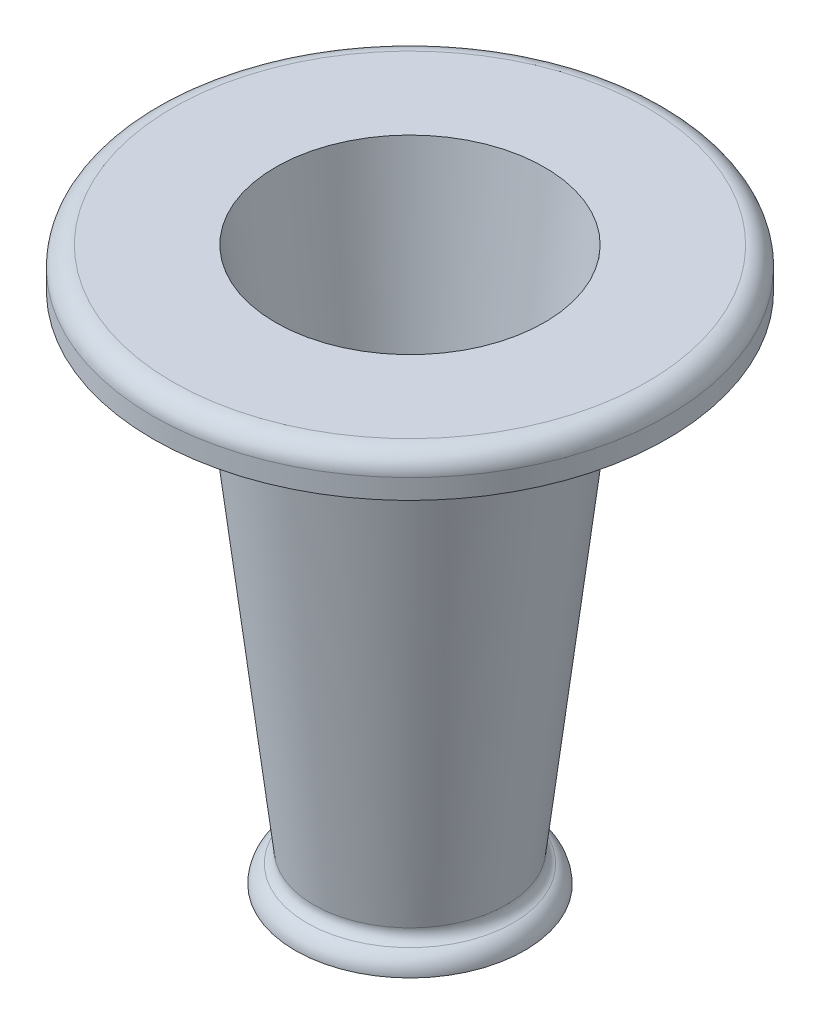
ISO-10303-21;
HEADER;
FILE_DESCRIPTION(('STEP AP214'),'2;1');
FILE_NAME('part.step','',(''),(''),'','','');
FILE_SCHEMA(('AUTOMOTIVE_DESIGN { 1 0 10303 214 1 1 1 1 }'));
ENDSEC;
DATA;
#1=APPLICATION_CONTEXT('core data for automotive mechanical design processes');
#2=APPLICATION_PROTOCOL_DEFINITION('international standard','automotive_design',2000,#1);
#3=PRODUCT_CONTEXT('',#1,'mechanical');
#4=PRODUCT('Part','Part','',(#3));
#5=PRODUCT_RELATED_PRODUCT_CATEGORY('part','',(#4));
#6=PRODUCT_DEFINITION_FORMATION('','',#4);
#7=PRODUCT_DEFINITION_CONTEXT('part definition',#1,'design');
#8=PRODUCT_DEFINITION('design','',#6,#7);
#9=PRODUCT_DEFINITION_SHAPE('','',#8);
#10=(LENGTH_UNIT() NAMED_UNIT(*) SI_UNIT(.MILLI.,.METRE.));
#11=(NAMED_UNIT(*) PLANE_ANGLE_UNIT() SI_UNIT($,.RADIAN.));
#12=(NAMED_UNIT(*) SI_UNIT($,.STERADIAN.) SOLID_ANGLE_UNIT());
#13=UNCERTAINTY_MEASURE_WITH_UNIT(LENGTH_MEASURE(1.E-05),#10,'distance_accuracy_value','');
#14=(GEOMETRIC_REPRESENTATION_CONTEXT(3) GLOBAL_UNCERTAINTY_ASSIGNED_CONTEXT((#13)) GLOBAL_UNIT_ASSIGNED_CONTEXT((#10,
#11,#12)) REPRESENTATION_CONTEXT('',''));
#15=CARTESIAN_POINT('',(0.,0.,0.));
#16=DIRECTION('',(0.,0.,1.));
#17=DIRECTION('',(1.,0.,0.));
#18=AXIS2_PLACEMENT_3D('',#15,#16,#17);
#19=CARTESIAN_POINT('',(0.,135.,0.));
#20=DIRECTION('',(0.,1.,0.));
#21=DIRECTION('',(0.,0.,1.));
#22=AXIS2_PLACEMENT_3D('',#19,#20,#21);
#23=PLANE('',#22);
#24=CARTESIAN_POINT('',(0.,135.,0.));
#25=DIRECTION('',(0.,1.,0.));
#26=DIRECTION('',(0.,0.,1.));
#27=AXIS2_PLACEMENT_3D('',#24,#25,#26);
#28=CIRCLE('',#27,57.5);
#29=CARTESIAN_POINT('',(0.,135.,57.5));
#30=VERTEX_POINT('',#29);
#31=EDGE_CURVE('E62',#30,#30,#28,.F.);
#32=ORIENTED_EDGE('',*,*,#31,.T.);
#33=EDGE_LOOP('',(#32));
#34=FACE_BOUND('',#33,.T.);
#35=CARTESIAN_POINT('',(0.,135.,0.));
#36=DIRECTION('',(0.,1.,0.));
#37=DIRECTION('',(0.,0.,1.));
#38=AXIS2_PLACEMENT_3D('',#35,#36,#37);
#39=CIRCLE('',#38,39.);
#40=CARTESIAN_POINT('',(0.,135.,39.));
#41=VERTEX_POINT('',#40);
#42=EDGE_CURVE('E68',#41,#41,#39,.T.);
#43=ORIENTED_EDGE('',*,*,#42,.T.);
#44=EDGE_LOOP('',(#43));
#45=FACE_BOUND('',#44,.T.);
#46=ADVANCED_FACE('F37',(#34,#45),#23,.F.);
#47=CARTESIAN_POINT('',(0.,0.,0.));
#48=DIRECTION('',(0.,1.,0.));
#49=DIRECTION('',(0.,0.,1.));
#50=AXIS2_PLACEMENT_3D('',#47,#48,#49);
#51=PLANE('',#50);
#52=CARTESIAN_POINT('',(0.,0.,0.));
#53=DIRECTION('',(0.,-1.,0.));
#54=DIRECTION('',(0.,0.,-1.));
#55=AXIS2_PLACEMENT_3D('',#52,#53,#54);
#56=CIRCLE('',#55,23.);
#57=CARTESIAN_POINT('',(0.,0.,-23.));
#58=VERTEX_POINT('',#57);
#59=EDGE_CURVE('E57',#58,#58,#56,.T.);
#60=ORIENTED_EDGE('',*,*,#59,.F.);
#61=EDGE_LOOP('',(#60));
#62=FACE_BOUND('',#61,.T.);
#63=CARTESIAN_POINT('',(0.,0.,0.));
#64=DIRECTION('',(0.,1.,0.));
#65=DIRECTION('',(0.,0.,1.));
#66=AXIS2_PLACEMENT_3D('',#63,#64,#65);
#67=CIRCLE('',#66,29.);
#68=CARTESIAN_POINT('',(0.,0.,29.));
#69=VERTEX_POINT('',#68);
#70=EDGE_CURVE('E65',#69,#69,#67,.T.);
#71=ORIENTED_EDGE('',*,*,#70,.F.);
#72=EDGE_LOOP('',(#71));
#73=FACE_BOUND('',#72,.T.);
#74=ADVANCED_FACE('F109',(#62,#73),#51,.F.);
#75=CARTESIAN_POINT('',(0.,5.,0.));
#76=DIRECTION('',(0.,1.,0.));
#77=DIRECTION('',(0.,0.,1.));
#78=AXIS2_PLACEMENT_3D('',#75,#76,#77);
#79=CONICAL_SURFACE('',#78,24.,0.114876605416899);
#80=CARTESIAN_POINT('',(0.,7.6384580295691,0.));
#81=DIRECTION('',(0.,1.,0.));
#82=DIRECTION('',(0.,0.,1.));
#83=AXIS2_PLACEMENT_3D('',#80,#81,#82);
#84=CIRCLE('',#83,24.3044374649503);
#85=CARTESIAN_POINT('',(0.,7.6384580295691,24.3044374649503));
#86=VERTEX_POINT('',#85);
#87=EDGE_CURVE('E44',#86,#86,#84,.T.);
#88=ORIENTED_EDGE('',*,*,#87,.T.);
#89=EDGE_LOOP('',(#88));
#90=FACE_BOUND('',#89,.T.);
#91=ORIENTED_EDGE('',*,*,#42,.F.);
#92=EDGE_LOOP('',(#91));
#93=FACE_BOUND('',#92,.T.);
#94=ADVANCED_FACE('F115',(#90,#93),#79,.T.);
#95=CARTESIAN_POINT('',(0.,130.,0.));
#96=DIRECTION('',(0.,-1.,0.));
#97=DIRECTION('',(0.,0.,-1.));
#98=AXIS2_PLACEMENT_3D('',#95,#96,#97);
#99=PLANE('',#98);
#100=CARTESIAN_POINT('',(0.,130.,0.));
#101=DIRECTION('',(0.,-1.,0.));
#102=DIRECTION('',(0.,0.,-1.));
#103=AXIS2_PLACEMENT_3D('',#100,#101,#102);
#104=CIRCLE('',#103,65.);
#105=CARTESIAN_POINT('',(0.,130.,-65.));
#106=VERTEX_POINT('',#105);
#107=EDGE_CURVE('E71',#106,#106,#104,.T.);
#108=ORIENTED_EDGE('',*,*,#107,.T.);
#109=EDGE_LOOP('',(#108));
#110=FACE_BOUND('',#109,.T.);
#111=CARTESIAN_POINT('',(0.,130.,0.));
#112=DIRECTION('',(0.,-1.,0.));
#113=DIRECTION('',(0.,0.,-1.));
#114=AXIS2_PLACEMENT_3D('',#111,#112,#113);
#115=CIRCLE('',#114,62.5);
#116=CARTESIAN_POINT('',(0.,130.,-62.5));
#117=VERTEX_POINT('',#116);
#118=EDGE_CURVE('E74',#117,#117,#115,.T.);
#119=ORIENTED_EDGE('',*,*,#118,.F.);
#120=EDGE_LOOP('',(#119));
#121=FACE_BOUND('',#120,.T.);
#122=ADVANCED_FACE('F89',(#110,#121),#99,.T.);
#123=CARTESIAN_POINT('',(0.,140.,0.));
#124=DIRECTION('',(0.,1.,0.));
#125=DIRECTION('',(0.,0.,1.));
#126=AXIS2_PLACEMENT_3D('',#123,#124,#125);
#127=PLANE('',#126);
#128=CARTESIAN_POINT('',(0.,140.,0.));
#129=DIRECTION('',(0.,1.,0.));
#130=DIRECTION('',(0.,0.,1.));
#131=AXIS2_PLACEMENT_3D('',#128,#129,#130);
#132=CIRCLE('',#131,34.);
#133=CARTESIAN_POINT('',(0.,140.,34.));
#134=VERTEX_POINT('',#133);
#135=EDGE_CURVE('E58',#134,#134,#132,.T.);
#136=ORIENTED_EDGE('',*,*,#135,.F.);
#137=EDGE_LOOP('',(#136));
#138=FACE_BOUND('',#137,.T.);
#139=CARTESIAN_POINT('',(0.,140.,0.));
#140=DIRECTION('',(0.,1.,0.));
#141=DIRECTION('',(0.,0.,1.));
#142=AXIS2_PLACEMENT_3D('',#139,#140,#141);
#143=CIRCLE('',#142,60.);
#144=CARTESIAN_POINT('',(0.,140.,60.));
#145=VERTEX_POINT('',#144);
#146=EDGE_CURVE('E52',#145,#145,#143,.T.);
#147=ORIENTED_EDGE('',*,*,#146,.T.);
#148=EDGE_LOOP('',(#147));
#149=FACE_BOUND('',#148,.T.);
#150=ADVANCED_FACE('F85',(#138,#149),#127,.T.);
#151=CARTESIAN_POINT('',(0.,140.,0.));
#152=DIRECTION('',(0.,-1.,0.));
#153=DIRECTION('',(0.,0.,-1.));
#154=AXIS2_PLACEMENT_3D('',#151,#152,#153);
#155=CYLINDRICAL_SURFACE('',#154,65.);
#156=CARTESIAN_POINT('',(0.,135.,0.));
#157=DIRECTION('',(0.,1.,0.));
#158=DIRECTION('',(0.,0.,1.));
#159=AXIS2_PLACEMENT_3D('',#156,#157,#158);
#160=CIRCLE('',#159,65.);
#161=CARTESIAN_POINT('',(0.,135.,65.));
#162=VERTEX_POINT('',#161);
#163=EDGE_CURVE('E48',#162,#162,#160,.F.);
#164=ORIENTED_EDGE('',*,*,#163,.T.);
#165=EDGE_LOOP('',(#164));
#166=FACE_BOUND('',#165,.T.);
#167=ORIENTED_EDGE('',*,*,#107,.F.);
#168=EDGE_LOOP('',(#167));
#169=FACE_BOUND('',#168,.T.);
#170=ADVANCED_FACE('F88',(#166,#169),#155,.T.);
#171=CARTESIAN_POINT('',(0.,0.,0.));
#172=DIRECTION('',(0.,1.,0.));
#173=DIRECTION('',(0.,0.,1.));
#174=AXIS2_PLACEMENT_3D('',#171,#172,#173);
#175=TOROIDAL_SURFACE('',#174,24.,5.);
#176=CARTESIAN_POINT('',(0.,4.55911606600861,0.));
#177=DIRECTION('',(0.,-1.,0.));
#178=DIRECTION('',(0.,0.,-1.));
#179=AXIS2_PLACEMENT_3D('',#176,#177,#178);
#180=CIRCLE('',#179,26.0529151703523);
#181=CARTESIAN_POINT('',(0.,4.55911606600861,-26.0529151703523));
#182=VERTEX_POINT('',#181);
#183=EDGE_CURVE('E11',#182,#182,#180,.T.);
#184=ORIENTED_EDGE('',*,*,#183,.T.);
#185=EDGE_LOOP('',(#184));
#186=FACE_BOUND('',#185,.T.);
#187=ORIENTED_EDGE('',*,*,#70,.T.);
#188=EDGE_LOOP('',(#187));
#189=FACE_BOUND('',#188,.T.);
#190=ADVANCED_FACE('F104',(#186,#189),#175,.T.);
#191=CARTESIAN_POINT('',(0.,130.,0.));
#192=DIRECTION('',(0.,1.,0.));
#193=DIRECTION('',(0.,0.,1.));
#194=AXIS2_PLACEMENT_3D('',#191,#192,#193);
#195=TOROIDAL_SURFACE('',#194,57.5,5.);
#196=ORIENTED_EDGE('',*,*,#118,.T.);
#197=EDGE_LOOP('',(#196));
#198=FACE_BOUND('',#197,.T.);
#199=ORIENTED_EDGE('',*,*,#31,.F.);
#200=EDGE_LOOP('',(#199));
#201=FACE_BOUND('',#200,.T.);
#202=ADVANCED_FACE('F96',(#198,#201),#195,.F.);
#203=CARTESIAN_POINT('',(0.,135.,0.));
#204=DIRECTION('',(0.,1.,0.));
#205=DIRECTION('',(0.,0.,1.));
#206=AXIS2_PLACEMENT_3D('',#203,#204,#205);
#207=TOROIDAL_SURFACE('',#206,60.,5.);
#208=ORIENTED_EDGE('',*,*,#163,.F.);
#209=EDGE_LOOP('',(#208));
#210=FACE_BOUND('',#209,.T.);
#211=ORIENTED_EDGE('',*,*,#146,.F.);
#212=EDGE_LOOP('',(#211));
#213=FACE_BOUND('',#212,.T.);
#214=ADVANCED_FACE('F93',(#210,#213),#207,.T.);
#215=CARTESIAN_POINT('',(0.,62.,0.));
#216=DIRECTION('',(0.,-1.,0.));
#217=DIRECTION('',(0.,0.,-1.));
#218=AXIS2_PLACEMENT_3D('',#215,#216,#217);
#219=CYLINDRICAL_SURFACE('',#218,23.);
#220=CARTESIAN_POINT('',(0.,46.456050594262,0.));
#221=DIRECTION('',(0.,1.,0.));
#222=DIRECTION('',(0.,0.,1.));
#223=AXIS2_PLACEMENT_3D('',#220,#221,#222);
#224=CIRCLE('',#223,23.);
#225=CARTESIAN_POINT('',(0.,46.456050594262,23.));
#226=VERTEX_POINT('',#225);
#227=EDGE_CURVE('E55',#226,#226,#224,.T.);
#228=ORIENTED_EDGE('',*,*,#227,.T.);
#229=EDGE_LOOP('',(#228));
#230=FACE_BOUND('',#229,.T.);
#231=ORIENTED_EDGE('',*,*,#59,.T.);
#232=EDGE_LOOP('',(#231));
#233=FACE_BOUND('',#232,.T.);
#234=ADVANCED_FACE('F95',(#230,#233),#219,.F.);
#235=CARTESIAN_POINT('',(0.,140.,0.));
#236=DIRECTION('',(0.,1.,0.));
#237=DIRECTION('',(0.,0.,1.));
#238=AXIS2_PLACEMENT_3D('',#235,#236,#237);
#239=CONICAL_SURFACE('',#238,34.,0.117054225126753);
#240=ORIENTED_EDGE('',*,*,#135,.T.);
#241=EDGE_LOOP('',(#240));
#242=FACE_BOUND('',#241,.T.);
#243=ORIENTED_EDGE('',*,*,#227,.F.);
#244=EDGE_LOOP('',(#243));
#245=FACE_BOUND('',#244,.T.);
#246=ADVANCED_FACE('F82',(#242,#245),#239,.F.);
#247=CARTESIAN_POINT('',(0.,7.2945857056137,0.));
#248=DIRECTION('',(0.,1.,0.));
#249=DIRECTION('',(0.,0.,1.));
#250=AXIS2_PLACEMENT_3D('',#247,#248,#249);
#251=TOROIDAL_SURFACE('',#250,27.2846642725637,3.);
#252=ORIENTED_EDGE('',*,*,#183,.F.);
#253=EDGE_LOOP('',(#252));
#254=FACE_BOUND('',#253,.T.);
#255=ORIENTED_EDGE('',*,*,#87,.F.);
#256=EDGE_LOOP('',(#255));
#257=FACE_BOUND('',#256,.T.);
#258=ADVANCED_FACE('F39',(#254,#257),#251,.F.);
#259=CLOSED_SHELL('',(#46,#74,#94,#122,#150,#170,#190,#202,#214,#234,#246,#258));
#260=MANIFOLD_SOLID_BREP('B2',#259);
#261=ADVANCED_BREP_SHAPE_REPRESENTATION('',(#18,#260),#14);
#262=SHAPE_DEFINITION_REPRESENTATION(#9,#261);
ENDSEC;
END-ISO-10303-21;
